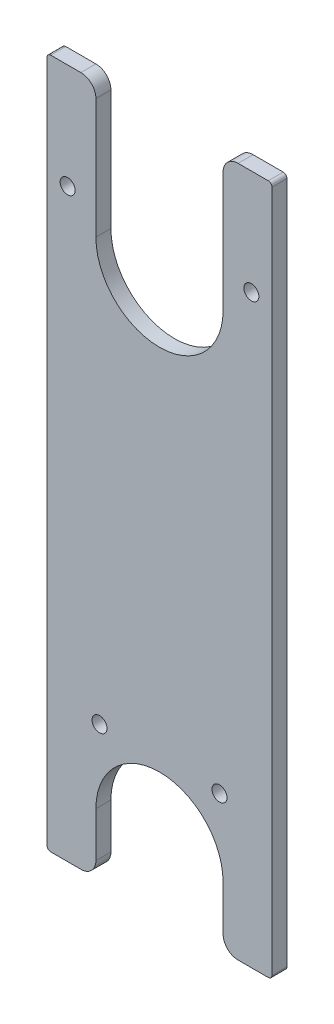
ISO-10303-21;
HEADER;
FILE_DESCRIPTION(('STEP AP214'),'2;1');
FILE_NAME('part.step','',(''),(''),'','','');
FILE_SCHEMA(('AUTOMOTIVE_DESIGN { 1 0 10303 214 1 1 1 1 }'));
ENDSEC;
DATA;
#1=APPLICATION_CONTEXT('core data for automotive mechanical design processes');
#2=APPLICATION_PROTOCOL_DEFINITION('international standard','automotive_design',2000,#1);
#3=PRODUCT_CONTEXT('',#1,'mechanical');
#4=PRODUCT('Part','Part','',(#3));
#5=PRODUCT_RELATED_PRODUCT_CATEGORY('part','',(#4));
#6=PRODUCT_DEFINITION_FORMATION('','',#4);
#7=PRODUCT_DEFINITION_CONTEXT('part definition',#1,'design');
#8=PRODUCT_DEFINITION('design','',#6,#7);
#9=PRODUCT_DEFINITION_SHAPE('','',#8);
#10=(LENGTH_UNIT() NAMED_UNIT(*) SI_UNIT(.MILLI.,.METRE.));
#11=(NAMED_UNIT(*) PLANE_ANGLE_UNIT() SI_UNIT($,.RADIAN.));
#12=(NAMED_UNIT(*) SI_UNIT($,.STERADIAN.) SOLID_ANGLE_UNIT());
#13=UNCERTAINTY_MEASURE_WITH_UNIT(LENGTH_MEASURE(1.E-05),#10,'distance_accuracy_value','');
#14=(GEOMETRIC_REPRESENTATION_CONTEXT(3) GLOBAL_UNCERTAINTY_ASSIGNED_CONTEXT((#13)) GLOBAL_UNIT_ASSIGNED_CONTEXT((#10,
#11,#12)) REPRESENTATION_CONTEXT('',''));
#15=CARTESIAN_POINT('',(0.,0.,0.));
#16=DIRECTION('',(0.,0.,1.));
#17=DIRECTION('',(1.,0.,0.));
#18=AXIS2_PLACEMENT_3D('',#15,#16,#17);
#19=CARTESIAN_POINT('',(-47.625,-279.4,6.35));
#20=DIRECTION('',(1.,0.,0.));
#21=DIRECTION('',(0.,0.,-1.));
#22=AXIS2_PLACEMENT_3D('',#19,#20,#21);
#23=PLANE('',#22);
#24=DIRECTION('',(0.,-1.,0.));
#25=VECTOR('',#24,1.);
#26=CARTESIAN_POINT('',(-47.625,-279.4,6.35));
#27=LINE('',#26,#25);
#28=CARTESIAN_POINT('',(-47.625,11.1125,6.35));
#29=VERTEX_POINT('',#28);
#30=CARTESIAN_POINT('',(-47.625,-277.8125,6.35));
#31=VERTEX_POINT('',#30);
#32=EDGE_CURVE('E281',#29,#31,#27,.T.);
#33=ORIENTED_EDGE('',*,*,#32,.F.);
#34=DIRECTION('',(0.,0.,-1.));
#35=VECTOR('',#34,1.);
#36=CARTESIAN_POINT('',(-47.625,11.1125,6.35));
#37=LINE('',#36,#35);
#38=CARTESIAN_POINT('',(-47.625,11.1125,0.));
#39=VERTEX_POINT('',#38);
#40=EDGE_CURVE('E347',#29,#39,#37,.T.);
#41=ORIENTED_EDGE('',*,*,#40,.T.);
#42=DIRECTION('',(0.,-1.,0.));
#43=VECTOR('',#42,1.);
#44=CARTESIAN_POINT('',(-47.625,-279.4,0.));
#45=LINE('',#44,#43);
#46=CARTESIAN_POINT('',(-47.625,-277.8125,0.));
#47=VERTEX_POINT('',#46);
#48=EDGE_CURVE('E239',#39,#47,#45,.T.);
#49=ORIENTED_EDGE('',*,*,#48,.T.);
#50=DIRECTION('',(0.,0.,-1.));
#51=VECTOR('',#50,1.);
#52=CARTESIAN_POINT('',(-47.625,-277.8125,6.35));
#53=LINE('',#52,#51);
#54=EDGE_CURVE('E344',#47,#31,#53,.F.);
#55=ORIENTED_EDGE('',*,*,#54,.T.);
#56=EDGE_LOOP('',(#33,#41,#49,#55));
#57=FACE_BOUND('',#56,.T.);
#58=ADVANCED_FACE('F40',(#57),#23,.F.);
#59=CARTESIAN_POINT('',(-47.625,-279.4,6.35));
#60=DIRECTION('',(0.,1.,0.));
#61=DIRECTION('',(0.,0.,1.));
#62=AXIS2_PLACEMENT_3D('',#59,#60,#61);
#63=PLANE('',#62);
#64=DIRECTION('',(1.,0.,0.));
#65=VECTOR('',#64,1.);
#66=CARTESIAN_POINT('',(-47.625,-279.4,6.35));
#67=LINE('',#66,#65);
#68=CARTESIAN_POINT('',(-46.0375,-279.4,6.35));
#69=VERTEX_POINT('',#68);
#70=CARTESIAN_POINT('',(-33.274,-279.4,6.35));
#71=VERTEX_POINT('',#70);
#72=EDGE_CURVE('E191',#69,#71,#67,.T.);
#73=ORIENTED_EDGE('',*,*,#72,.F.);
#74=DIRECTION('',(0.,0.,-1.));
#75=VECTOR('',#74,1.);
#76=CARTESIAN_POINT('',(-46.0375,-279.4,6.35));
#77=LINE('',#76,#75);
#78=CARTESIAN_POINT('',(-46.0375,-279.4,0.));
#79=VERTEX_POINT('',#78);
#80=EDGE_CURVE('E11',#69,#79,#77,.T.);
#81=ORIENTED_EDGE('',*,*,#80,.T.);
#82=DIRECTION('',(1.,0.,0.));
#83=VECTOR('',#82,1.);
#84=CARTESIAN_POINT('',(-47.625,-279.4,0.));
#85=LINE('',#84,#83);
#86=CARTESIAN_POINT('',(-33.274,-279.4,0.));
#87=VERTEX_POINT('',#86);
#88=EDGE_CURVE('E243',#79,#87,#85,.T.);
#89=ORIENTED_EDGE('',*,*,#88,.T.);
#90=DIRECTION('',(0.,0.,-1.));
#91=VECTOR('',#90,1.);
#92=CARTESIAN_POINT('',(-33.274,-279.4,6.35));
#93=LINE('',#92,#91);
#94=EDGE_CURVE('E325',#87,#71,#93,.F.);
#95=ORIENTED_EDGE('',*,*,#94,.T.);
#96=EDGE_LOOP('',(#73,#81,#89,#95));
#97=FACE_BOUND('',#96,.T.);
#98=ADVANCED_FACE('F512',(#97),#63,.F.);
#99=CARTESIAN_POINT('',(-26.924,-279.4,6.35));
#100=DIRECTION('',(-1.,0.,0.));
#101=DIRECTION('',(0.,-1.,0.));
#102=AXIS2_PLACEMENT_3D('',#99,#100,#101);
#103=PLANE('',#102);
#104=DIRECTION('',(0.,1.,0.));
#105=VECTOR('',#104,1.);
#106=CARTESIAN_POINT('',(-26.924,-279.4,6.35));
#107=LINE('',#106,#105);
#108=CARTESIAN_POINT('',(-26.924,-273.05,6.35));
#109=VERTEX_POINT('',#108);
#110=CARTESIAN_POINT('',(-26.924,-254.,6.35));
#111=VERTEX_POINT('',#110);
#112=EDGE_CURVE('E177',#109,#111,#107,.T.);
#113=ORIENTED_EDGE('',*,*,#112,.F.);
#114=DIRECTION('',(0.,0.,-1.));
#115=VECTOR('',#114,1.);
#116=CARTESIAN_POINT('',(-26.924,-273.05,6.35));
#117=LINE('',#116,#115);
#118=CARTESIAN_POINT('',(-26.924,-273.05,0.));
#119=VERTEX_POINT('',#118);
#120=EDGE_CURVE('E322',#109,#119,#117,.T.);
#121=ORIENTED_EDGE('',*,*,#120,.T.);
#122=DIRECTION('',(0.,1.,0.));
#123=VECTOR('',#122,1.);
#124=CARTESIAN_POINT('',(-26.924,-279.4,0.));
#125=LINE('',#124,#123);
#126=CARTESIAN_POINT('',(-26.924,-254.,0.));
#127=VERTEX_POINT('',#126);
#128=EDGE_CURVE('E197',#119,#127,#125,.T.);
#129=ORIENTED_EDGE('',*,*,#128,.T.);
#130=DIRECTION('',(0.,0.,-1.));
#131=VECTOR('',#130,1.);
#132=CARTESIAN_POINT('',(-26.924,-254.,6.35));
#133=LINE('',#132,#131);
#134=EDGE_CURVE('E194',#111,#127,#133,.T.);
#135=ORIENTED_EDGE('',*,*,#134,.F.);
#136=EDGE_LOOP('',(#113,#121,#129,#135));
#137=FACE_BOUND('',#136,.T.);
#138=ADVANCED_FACE('F195',(#137),#103,.F.);
#139=CARTESIAN_POINT('',(0.,-254.,6.35));
#140=DIRECTION('',(0.,0.,-1.));
#141=DIRECTION('',(-1.,0.,0.));
#142=AXIS2_PLACEMENT_3D('',#139,#140,#141);
#143=CYLINDRICAL_SURFACE('',#142,26.924);
#144=CARTESIAN_POINT('',(0.,-254.,0.));
#145=DIRECTION('',(0.,0.,-1.));
#146=DIRECTION('',(-1.,0.,0.));
#147=AXIS2_PLACEMENT_3D('',#144,#145,#146);
#148=CIRCLE('',#147,26.924);
#149=CARTESIAN_POINT('',(26.924,-254.,0.));
#150=VERTEX_POINT('',#149);
#151=EDGE_CURVE('E249',#127,#150,#148,.T.);
#152=ORIENTED_EDGE('',*,*,#151,.T.);
#153=DIRECTION('',(0.,0.,-1.));
#154=VECTOR('',#153,1.);
#155=CARTESIAN_POINT('',(26.924,-254.,6.35));
#156=LINE('',#155,#154);
#157=CARTESIAN_POINT('',(26.924,-254.,6.35));
#158=VERTEX_POINT('',#157);
#159=EDGE_CURVE('E202',#158,#150,#156,.T.);
#160=ORIENTED_EDGE('',*,*,#159,.F.);
#161=CARTESIAN_POINT('',(0.,-254.,6.35));
#162=DIRECTION('',(0.,0.,-1.));
#163=DIRECTION('',(-1.,0.,0.));
#164=AXIS2_PLACEMENT_3D('',#161,#162,#163);
#165=CIRCLE('',#164,26.924);
#166=EDGE_CURVE('E183',#111,#158,#165,.T.);
#167=ORIENTED_EDGE('',*,*,#166,.F.);
#168=ORIENTED_EDGE('',*,*,#134,.T.);
#169=EDGE_LOOP('',(#152,#160,#167,#168));
#170=FACE_BOUND('',#169,.T.);
#171=ADVANCED_FACE('F204',(#170),#143,.F.);
#172=CARTESIAN_POINT('',(26.924,-279.4,6.35));
#173=DIRECTION('',(1.,0.,0.));
#174=DIRECTION('',(0.,1.,0.));
#175=AXIS2_PLACEMENT_3D('',#172,#173,#174);
#176=PLANE('',#175);
#177=DIRECTION('',(0.,-1.,0.));
#178=VECTOR('',#177,1.);
#179=CARTESIAN_POINT('',(26.924,-279.4,0.));
#180=LINE('',#179,#178);
#181=CARTESIAN_POINT('',(26.924,-273.05,0.));
#182=VERTEX_POINT('',#181);
#183=EDGE_CURVE('E252',#150,#182,#180,.T.);
#184=ORIENTED_EDGE('',*,*,#183,.T.);
#185=DIRECTION('',(0.,0.,-1.));
#186=VECTOR('',#185,1.);
#187=CARTESIAN_POINT('',(26.924,-273.05,6.35));
#188=LINE('',#187,#186);
#189=CARTESIAN_POINT('',(26.924,-273.05,6.35));
#190=VERTEX_POINT('',#189);
#191=EDGE_CURVE('E308',#182,#190,#188,.F.);
#192=ORIENTED_EDGE('',*,*,#191,.T.);
#193=DIRECTION('',(0.,-1.,0.));
#194=VECTOR('',#193,1.);
#195=CARTESIAN_POINT('',(26.924,-279.4,6.35));
#196=LINE('',#195,#194);
#197=EDGE_CURVE('E208',#158,#190,#196,.T.);
#198=ORIENTED_EDGE('',*,*,#197,.F.);
#199=ORIENTED_EDGE('',*,*,#159,.T.);
#200=EDGE_LOOP('',(#184,#192,#198,#199));
#201=FACE_BOUND('',#200,.T.);
#202=ADVANCED_FACE('F700',(#201),#176,.F.);
#203=CARTESIAN_POINT('',(47.625,-279.4,6.35));
#204=DIRECTION('',(0.,1.,0.));
#205=DIRECTION('',(0.,0.,1.));
#206=AXIS2_PLACEMENT_3D('',#203,#204,#205);
#207=PLANE('',#206);
#208=DIRECTION('',(1.,0.,0.));
#209=VECTOR('',#208,1.);
#210=CARTESIAN_POINT('',(47.625,-279.4,0.));
#211=LINE('',#210,#209);
#212=CARTESIAN_POINT('',(33.274,-279.4,0.));
#213=VERTEX_POINT('',#212);
#214=CARTESIAN_POINT('',(46.0375,-279.4,0.));
#215=VERTEX_POINT('',#214);
#216=EDGE_CURVE('E256',#213,#215,#211,.T.);
#217=ORIENTED_EDGE('',*,*,#216,.T.);
#218=DIRECTION('',(0.,0.,-1.));
#219=VECTOR('',#218,1.);
#220=CARTESIAN_POINT('',(46.0375,-279.4,6.35));
#221=LINE('',#220,#219);
#222=CARTESIAN_POINT('',(46.0375,-279.4,6.35));
#223=VERTEX_POINT('',#222);
#224=EDGE_CURVE('E49',#215,#223,#221,.F.);
#225=ORIENTED_EDGE('',*,*,#224,.T.);
#226=DIRECTION('',(1.,0.,0.));
#227=VECTOR('',#226,1.);
#228=CARTESIAN_POINT('',(47.625,-279.4,6.35));
#229=LINE('',#228,#227);
#230=CARTESIAN_POINT('',(33.274,-279.4,6.35));
#231=VERTEX_POINT('',#230);
#232=EDGE_CURVE('E212',#231,#223,#229,.T.);
#233=ORIENTED_EDGE('',*,*,#232,.F.);
#234=DIRECTION('',(0.,0.,-1.));
#235=VECTOR('',#234,1.);
#236=CARTESIAN_POINT('',(33.274,-279.4,6.35));
#237=LINE('',#236,#235);
#238=EDGE_CURVE('E201',#231,#213,#237,.T.);
#239=ORIENTED_EDGE('',*,*,#238,.T.);
#240=EDGE_LOOP('',(#217,#225,#233,#239));
#241=FACE_BOUND('',#240,.T.);
#242=ADVANCED_FACE('F391',(#241),#207,.F.);
#243=CARTESIAN_POINT('',(47.625,-279.4,6.35));
#244=DIRECTION('',(-1.,0.,0.));
#245=DIRECTION('',(0.,-1.,0.));
#246=AXIS2_PLACEMENT_3D('',#243,#244,#245);
#247=PLANE('',#246);
#248=DIRECTION('',(0.,1.,0.));
#249=VECTOR('',#248,1.);
#250=CARTESIAN_POINT('',(47.625,-279.4,0.));
#251=LINE('',#250,#249);
#252=CARTESIAN_POINT('',(47.625,-277.8125,0.));
#253=VERTEX_POINT('',#252);
#254=CARTESIAN_POINT('',(47.625,11.1125,0.));
#255=VERTEX_POINT('',#254);
#256=EDGE_CURVE('E260',#253,#255,#251,.T.);
#257=ORIENTED_EDGE('',*,*,#256,.T.);
#258=DIRECTION('',(0.,0.,-1.));
#259=VECTOR('',#258,1.);
#260=CARTESIAN_POINT('',(47.625,11.1125,6.35));
#261=LINE('',#260,#259);
#262=CARTESIAN_POINT('',(47.625,11.1125,6.35));
#263=VERTEX_POINT('',#262);
#264=EDGE_CURVE('E384',#255,#263,#261,.F.);
#265=ORIENTED_EDGE('',*,*,#264,.T.);
#266=DIRECTION('',(0.,1.,0.));
#267=VECTOR('',#266,1.);
#268=CARTESIAN_POINT('',(47.625,-279.4,6.35));
#269=LINE('',#268,#267);
#270=CARTESIAN_POINT('',(47.625,-277.8125,6.35));
#271=VERTEX_POINT('',#270);
#272=EDGE_CURVE('E219',#271,#263,#269,.T.);
#273=ORIENTED_EDGE('',*,*,#272,.F.);
#274=DIRECTION('',(0.,0.,-1.));
#275=VECTOR('',#274,1.);
#276=CARTESIAN_POINT('',(47.625,-277.8125,6.35));
#277=LINE('',#276,#275);
#278=EDGE_CURVE('E380',#271,#253,#277,.T.);
#279=ORIENTED_EDGE('',*,*,#278,.T.);
#280=EDGE_LOOP('',(#257,#265,#273,#279));
#281=FACE_BOUND('',#280,.T.);
#282=ADVANCED_FACE('F402',(#281),#247,.F.);
#283=CARTESIAN_POINT('',(47.625,12.7,6.35));
#284=DIRECTION('',(0.,-1.,0.));
#285=DIRECTION('',(1.,0.,0.));
#286=AXIS2_PLACEMENT_3D('',#283,#284,#285);
#287=PLANE('',#286);
#288=DIRECTION('',(-1.,0.,0.));
#289=VECTOR('',#288,1.);
#290=CARTESIAN_POINT('',(47.625,12.7,6.35));
#291=LINE('',#290,#289);
#292=CARTESIAN_POINT('',(46.0375,12.7,6.35));
#293=VERTEX_POINT('',#292);
#294=CARTESIAN_POINT('',(33.274,12.7,6.35));
#295=VERTEX_POINT('',#294);
#296=EDGE_CURVE('E222',#293,#295,#291,.T.);
#297=ORIENTED_EDGE('',*,*,#296,.F.);
#298=DIRECTION('',(0.,0.,-1.));
#299=VECTOR('',#298,1.);
#300=CARTESIAN_POINT('',(46.0375,12.7,6.35));
#301=LINE('',#300,#299);
#302=CARTESIAN_POINT('',(46.0375,12.7,0.));
#303=VERTEX_POINT('',#302);
#304=EDGE_CURVE('E376',#293,#303,#301,.T.);
#305=ORIENTED_EDGE('',*,*,#304,.T.);
#306=DIRECTION('',(-1.,0.,0.));
#307=VECTOR('',#306,1.);
#308=CARTESIAN_POINT('',(47.625,12.7,0.));
#309=LINE('',#308,#307);
#310=CARTESIAN_POINT('',(33.274,12.7,0.));
#311=VERTEX_POINT('',#310);
#312=EDGE_CURVE('E264',#303,#311,#309,.T.);
#313=ORIENTED_EDGE('',*,*,#312,.T.);
#314=DIRECTION('',(0.,0.,-1.));
#315=VECTOR('',#314,1.);
#316=CARTESIAN_POINT('',(33.274,12.7,6.35));
#317=LINE('',#316,#315);
#318=EDGE_CURVE('E333',#311,#295,#317,.F.);
#319=ORIENTED_EDGE('',*,*,#318,.T.);
#320=EDGE_LOOP('',(#297,#305,#313,#319));
#321=FACE_BOUND('',#320,.T.);
#322=ADVANCED_FACE('F412',(#321),#287,.F.);
#323=CARTESIAN_POINT('',(26.924,12.7,6.35));
#324=DIRECTION('',(1.,0.,0.));
#325=DIRECTION('',(0.,1.,0.));
#326=AXIS2_PLACEMENT_3D('',#323,#324,#325);
#327=PLANE('',#326);
#328=DIRECTION('',(0.,-1.,0.));
#329=VECTOR('',#328,1.);
#330=CARTESIAN_POINT('',(26.924,12.7,6.35));
#331=LINE('',#330,#329);
#332=CARTESIAN_POINT('',(26.924,6.35000000000001,6.35));
#333=VERTEX_POINT('',#332);
#334=CARTESIAN_POINT('',(26.924,-44.45,6.35));
#335=VERTEX_POINT('',#334);
#336=EDGE_CURVE('E225',#333,#335,#331,.T.);
#337=ORIENTED_EDGE('',*,*,#336,.F.);
#338=DIRECTION('',(0.,0.,-1.));
#339=VECTOR('',#338,1.);
#340=CARTESIAN_POINT('',(26.924,6.35000000000001,6.35));
#341=LINE('',#340,#339);
#342=CARTESIAN_POINT('',(26.924,6.35000000000001,0.));
#343=VERTEX_POINT('',#342);
#344=EDGE_CURVE('E329',#333,#343,#341,.T.);
#345=ORIENTED_EDGE('',*,*,#344,.T.);
#346=DIRECTION('',(0.,-1.,0.));
#347=VECTOR('',#346,1.);
#348=CARTESIAN_POINT('',(26.924,12.7,0.));
#349=LINE('',#348,#347);
#350=CARTESIAN_POINT('',(26.924,-44.45,0.));
#351=VERTEX_POINT('',#350);
#352=EDGE_CURVE('E267',#343,#351,#349,.T.);
#353=ORIENTED_EDGE('',*,*,#352,.T.);
#354=DIRECTION('',(0.,0.,-1.));
#355=VECTOR('',#354,1.);
#356=CARTESIAN_POINT('',(26.924,-44.45,6.35));
#357=LINE('',#356,#355);
#358=EDGE_CURVE('E285',#335,#351,#357,.T.);
#359=ORIENTED_EDGE('',*,*,#358,.F.);
#360=EDGE_LOOP('',(#337,#345,#353,#359));
#361=FACE_BOUND('',#360,.T.);
#362=ADVANCED_FACE('F420',(#361),#327,.F.);
#363=CARTESIAN_POINT('',(0.,-44.45,6.35));
#364=DIRECTION('',(0.,0.,-1.));
#365=DIRECTION('',(-1.,0.,0.));
#366=AXIS2_PLACEMENT_3D('',#363,#364,#365);
#367=CYLINDRICAL_SURFACE('',#366,26.924);
#368=CARTESIAN_POINT('',(0.,-44.45,0.));
#369=DIRECTION('',(0.,0.,-1.));
#370=DIRECTION('',(1.,0.,0.));
#371=AXIS2_PLACEMENT_3D('',#368,#369,#370);
#372=CIRCLE('',#371,26.924);
#373=CARTESIAN_POINT('',(-26.924,-44.45,0.));
#374=VERTEX_POINT('',#373);
#375=EDGE_CURVE('E270',#351,#374,#372,.T.);
#376=ORIENTED_EDGE('',*,*,#375,.T.);
#377=DIRECTION('',(0.,0.,-1.));
#378=VECTOR('',#377,1.);
#379=CARTESIAN_POINT('',(-26.924,-44.45,6.35));
#380=LINE('',#379,#378);
#381=CARTESIAN_POINT('',(-26.924,-44.45,6.35));
#382=VERTEX_POINT('',#381);
#383=EDGE_CURVE('E238',#382,#374,#380,.T.);
#384=ORIENTED_EDGE('',*,*,#383,.F.);
#385=CARTESIAN_POINT('',(0.,-44.45,6.35));
#386=DIRECTION('',(0.,0.,-1.));
#387=DIRECTION('',(1.,0.,0.));
#388=AXIS2_PLACEMENT_3D('',#385,#386,#387);
#389=CIRCLE('',#388,26.924);
#390=EDGE_CURVE('E228',#335,#382,#389,.T.);
#391=ORIENTED_EDGE('',*,*,#390,.F.);
#392=ORIENTED_EDGE('',*,*,#358,.T.);
#393=EDGE_LOOP('',(#376,#384,#391,#392));
#394=FACE_BOUND('',#393,.T.);
#395=ADVANCED_FACE('F427',(#394),#367,.F.);
#396=CARTESIAN_POINT('',(-26.924,12.7,6.35));
#397=DIRECTION('',(-1.,0.,0.));
#398=DIRECTION('',(0.,-1.,0.));
#399=AXIS2_PLACEMENT_3D('',#396,#397,#398);
#400=PLANE('',#399);
#401=DIRECTION('',(0.,1.,0.));
#402=VECTOR('',#401,1.);
#403=CARTESIAN_POINT('',(-26.924,12.7,0.));
#404=LINE('',#403,#402);
#405=CARTESIAN_POINT('',(-26.924,6.35,0.));
#406=VERTEX_POINT('',#405);
#407=EDGE_CURVE('E273',#374,#406,#404,.T.);
#408=ORIENTED_EDGE('',*,*,#407,.T.);
#409=DIRECTION('',(0.,0.,-1.));
#410=VECTOR('',#409,1.);
#411=CARTESIAN_POINT('',(-26.924,6.35,6.35));
#412=LINE('',#411,#410);
#413=CARTESIAN_POINT('',(-26.924,6.35,6.35));
#414=VERTEX_POINT('',#413);
#415=EDGE_CURVE('E341',#406,#414,#412,.F.);
#416=ORIENTED_EDGE('',*,*,#415,.T.);
#417=DIRECTION('',(0.,1.,0.));
#418=VECTOR('',#417,1.);
#419=CARTESIAN_POINT('',(-26.924,12.7,6.35));
#420=LINE('',#419,#418);
#421=EDGE_CURVE('E231',#382,#414,#420,.T.);
#422=ORIENTED_EDGE('',*,*,#421,.F.);
#423=ORIENTED_EDGE('',*,*,#383,.T.);
#424=EDGE_LOOP('',(#408,#416,#422,#423));
#425=FACE_BOUND('',#424,.T.);
#426=ADVANCED_FACE('F649',(#425),#400,.F.);
#427=CARTESIAN_POINT('',(-47.625,12.7,6.35));
#428=DIRECTION('',(0.,-1.,0.));
#429=DIRECTION('',(0.,0.,-1.));
#430=AXIS2_PLACEMENT_3D('',#427,#428,#429);
#431=PLANE('',#430);
#432=DIRECTION('',(-1.,0.,0.));
#433=VECTOR('',#432,1.);
#434=CARTESIAN_POINT('',(-47.625,12.7,0.));
#435=LINE('',#434,#433);
#436=CARTESIAN_POINT('',(-33.274,12.7,0.));
#437=VERTEX_POINT('',#436);
#438=CARTESIAN_POINT('',(-46.0375,12.7,0.));
#439=VERTEX_POINT('',#438);
#440=EDGE_CURVE('E277',#437,#439,#435,.T.);
#441=ORIENTED_EDGE('',*,*,#440,.T.);
#442=DIRECTION('',(0.,0.,-1.));
#443=VECTOR('',#442,1.);
#444=CARTESIAN_POINT('',(-46.0375,12.7,6.35));
#445=LINE('',#444,#443);
#446=CARTESIAN_POINT('',(-46.0375,12.7,6.35));
#447=VERTEX_POINT('',#446);
#448=EDGE_CURVE('E363',#439,#447,#445,.F.);
#449=ORIENTED_EDGE('',*,*,#448,.T.);
#450=DIRECTION('',(-1.,0.,0.));
#451=VECTOR('',#450,1.);
#452=CARTESIAN_POINT('',(-47.625,12.7,6.35));
#453=LINE('',#452,#451);
#454=CARTESIAN_POINT('',(-33.274,12.7,6.35));
#455=VERTEX_POINT('',#454);
#456=EDGE_CURVE('E235',#455,#447,#453,.T.);
#457=ORIENTED_EDGE('',*,*,#456,.F.);
#458=DIRECTION('',(0.,0.,-1.));
#459=VECTOR('',#458,1.);
#460=CARTESIAN_POINT('',(-33.274,12.7,6.35));
#461=LINE('',#460,#459);
#462=EDGE_CURVE('E337',#455,#437,#461,.T.);
#463=ORIENTED_EDGE('',*,*,#462,.T.);
#464=EDGE_LOOP('',(#441,#449,#457,#463));
#465=FACE_BOUND('',#464,.T.);
#466=ADVANCED_FACE('F439',(#465),#431,.F.);
#467=CARTESIAN_POINT('',(0.,-44.45,6.35));
#468=DIRECTION('',(0.,0.,1.));
#469=DIRECTION('',(1.,0.,0.));
#470=AXIS2_PLACEMENT_3D('',#467,#468,#469);
#471=PLANE('',#470);
#472=CARTESIAN_POINT('',(-25.4,-222.25,6.35));
#473=DIRECTION('',(0.,0.,1.));
#474=DIRECTION('',(1.,0.,0.));
#475=AXIS2_PLACEMENT_3D('',#472,#473,#474);
#476=CIRCLE('',#475,3.17499999999999);
#477=CARTESIAN_POINT('',(-22.225,-222.25,6.35));
#478=VERTEX_POINT('',#477);
#479=EDGE_CURVE('E480',#478,#478,#476,.T.);
#480=ORIENTED_EDGE('',*,*,#479,.F.);
#481=EDGE_LOOP('',(#480));
#482=FACE_BOUND('',#481,.T.);
#483=CARTESIAN_POINT('',(-38.89375,-31.75,6.35));
#484=DIRECTION('',(0.,0.,1.));
#485=DIRECTION('',(1.,0.,0.));
#486=AXIS2_PLACEMENT_3D('',#483,#484,#485);
#487=CIRCLE('',#486,3.17499999999999);
#488=CARTESIAN_POINT('',(-35.71875,-31.75,6.35));
#489=VERTEX_POINT('',#488);
#490=EDGE_CURVE('E472',#489,#489,#487,.T.);
#491=ORIENTED_EDGE('',*,*,#490,.F.);
#492=EDGE_LOOP('',(#491));
#493=FACE_BOUND('',#492,.T.);
#494=CARTESIAN_POINT('',(38.89375,-31.75,6.35));
#495=DIRECTION('',(0.,0.,1.));
#496=DIRECTION('',(1.,0.,0.));
#497=AXIS2_PLACEMENT_3D('',#494,#495,#496);
#498=CIRCLE('',#497,3.17499999999999);
#499=CARTESIAN_POINT('',(42.06875,-31.75,6.35));
#500=VERTEX_POINT('',#499);
#501=EDGE_CURVE('E464',#500,#500,#498,.T.);
#502=ORIENTED_EDGE('',*,*,#501,.F.);
#503=EDGE_LOOP('',(#502));
#504=FACE_BOUND('',#503,.T.);
#505=CARTESIAN_POINT('',(25.4,-222.25,6.35));
#506=DIRECTION('',(0.,0.,1.));
#507=DIRECTION('',(1.,0.,0.));
#508=AXIS2_PLACEMENT_3D('',#505,#506,#507);
#509=CIRCLE('',#508,3.17499999999999);
#510=CARTESIAN_POINT('',(28.575,-222.25,6.35));
#511=VERTEX_POINT('',#510);
#512=EDGE_CURVE('E456',#511,#511,#509,.T.);
#513=ORIENTED_EDGE('',*,*,#512,.F.);
#514=EDGE_LOOP('',(#513));
#515=FACE_BOUND('',#514,.T.);
#516=ORIENTED_EDGE('',*,*,#456,.T.);
#517=CARTESIAN_POINT('',(-46.0375,11.1125,6.35));
#518=DIRECTION('',(0.,0.,1.));
#519=DIRECTION('',(1.,0.,0.));
#520=AXIS2_PLACEMENT_3D('',#517,#518,#519);
#521=CIRCLE('',#520,1.5875);
#522=EDGE_CURVE('E373',#447,#29,#521,.T.);
#523=ORIENTED_EDGE('',*,*,#522,.T.);
#524=ORIENTED_EDGE('',*,*,#32,.T.);
#525=CARTESIAN_POINT('',(-46.0375,-277.8125,6.35));
#526=DIRECTION('',(0.,0.,1.));
#527=DIRECTION('',(1.,0.,0.));
#528=AXIS2_PLACEMENT_3D('',#525,#526,#527);
#529=CIRCLE('',#528,1.5875);
#530=EDGE_CURVE('E56',#31,#69,#529,.T.);
#531=ORIENTED_EDGE('',*,*,#530,.T.);
#532=ORIENTED_EDGE('',*,*,#72,.T.);
#533=CARTESIAN_POINT('',(-33.274,-273.05,6.35));
#534=DIRECTION('',(0.,0.,1.));
#535=DIRECTION('',(1.,0.,0.));
#536=AXIS2_PLACEMENT_3D('',#533,#534,#535);
#537=CIRCLE('',#536,6.35);
#538=EDGE_CURVE('E186',#71,#109,#537,.T.);
#539=ORIENTED_EDGE('',*,*,#538,.T.);
#540=ORIENTED_EDGE('',*,*,#112,.T.);
#541=ORIENTED_EDGE('',*,*,#166,.T.);
#542=ORIENTED_EDGE('',*,*,#197,.T.);
#543=CARTESIAN_POINT('',(33.274,-273.05,6.35));
#544=DIRECTION('',(0.,0.,1.));
#545=DIRECTION('',(1.,0.,0.));
#546=AXIS2_PLACEMENT_3D('',#543,#544,#545);
#547=CIRCLE('',#546,6.35);
#548=EDGE_CURVE('E319',#190,#231,#547,.T.);
#549=ORIENTED_EDGE('',*,*,#548,.T.);
#550=ORIENTED_EDGE('',*,*,#232,.T.);
#551=CARTESIAN_POINT('',(46.0375,-277.8125,6.35));
#552=DIRECTION('',(0.,0.,1.));
#553=DIRECTION('',(1.,0.,0.));
#554=AXIS2_PLACEMENT_3D('',#551,#552,#553);
#555=CIRCLE('',#554,1.5875);
#556=EDGE_CURVE('E368',#223,#271,#555,.T.);
#557=ORIENTED_EDGE('',*,*,#556,.T.);
#558=ORIENTED_EDGE('',*,*,#272,.T.);
#559=CARTESIAN_POINT('',(46.0375,11.1125,6.35));
#560=DIRECTION('',(0.,0.,1.));
#561=DIRECTION('',(1.,0.,0.));
#562=AXIS2_PLACEMENT_3D('',#559,#560,#561);
#563=CIRCLE('',#562,1.5875);
#564=EDGE_CURVE('E63',#263,#293,#563,.T.);
#565=ORIENTED_EDGE('',*,*,#564,.T.);
#566=ORIENTED_EDGE('',*,*,#296,.T.);
#567=CARTESIAN_POINT('',(33.274,6.35000000000001,6.35));
#568=DIRECTION('',(0.,0.,1.));
#569=DIRECTION('',(1.,0.,0.));
#570=AXIS2_PLACEMENT_3D('',#567,#568,#569);
#571=CIRCLE('',#570,6.35);
#572=EDGE_CURVE('E314',#295,#333,#571,.T.);
#573=ORIENTED_EDGE('',*,*,#572,.T.);
#574=ORIENTED_EDGE('',*,*,#336,.T.);
#575=ORIENTED_EDGE('',*,*,#390,.T.);
#576=ORIENTED_EDGE('',*,*,#421,.T.);
#577=CARTESIAN_POINT('',(-33.274,6.35,6.35));
#578=DIRECTION('',(0.,0.,1.));
#579=DIRECTION('',(1.,0.,0.));
#580=AXIS2_PLACEMENT_3D('',#577,#578,#579);
#581=CIRCLE('',#580,6.35);
#582=EDGE_CURVE('E311',#414,#455,#581,.T.);
#583=ORIENTED_EDGE('',*,*,#582,.T.);
#584=EDGE_LOOP('',(#516,#523,#524,#531,#532,#539,#540,#541,#542,#549,#550,#557,#558,#565,#566,
#573,#574,#575,#576,#583));
#585=FACE_BOUND('',#584,.T.);
#586=ADVANCED_FACE('F180',(#482,#493,#504,#515,#585),#471,.T.);
#587=CARTESIAN_POINT('',(0.,-44.45,0.));
#588=DIRECTION('',(0.,0.,1.));
#589=DIRECTION('',(1.,0.,0.));
#590=AXIS2_PLACEMENT_3D('',#587,#588,#589);
#591=PLANE('',#590);
#592=CARTESIAN_POINT('',(-25.4,-222.25,0.));
#593=DIRECTION('',(0.,0.,1.));
#594=DIRECTION('',(1.,0.,0.));
#595=AXIS2_PLACEMENT_3D('',#592,#593,#594);
#596=CIRCLE('',#595,3.17499999999999);
#597=CARTESIAN_POINT('',(-22.225,-222.25,0.));
#598=VERTEX_POINT('',#597);
#599=EDGE_CURVE('E476',#598,#598,#596,.T.);
#600=ORIENTED_EDGE('',*,*,#599,.T.);
#601=EDGE_LOOP('',(#600));
#602=FACE_BOUND('',#601,.T.);
#603=CARTESIAN_POINT('',(-38.89375,-31.75,0.));
#604=DIRECTION('',(0.,0.,1.));
#605=DIRECTION('',(1.,0.,0.));
#606=AXIS2_PLACEMENT_3D('',#603,#604,#605);
#607=CIRCLE('',#606,3.17499999999999);
#608=CARTESIAN_POINT('',(-35.71875,-31.75,0.));
#609=VERTEX_POINT('',#608);
#610=EDGE_CURVE('E468',#609,#609,#607,.T.);
#611=ORIENTED_EDGE('',*,*,#610,.T.);
#612=EDGE_LOOP('',(#611));
#613=FACE_BOUND('',#612,.T.);
#614=CARTESIAN_POINT('',(38.89375,-31.75,0.));
#615=DIRECTION('',(0.,0.,1.));
#616=DIRECTION('',(1.,0.,0.));
#617=AXIS2_PLACEMENT_3D('',#614,#615,#616);
#618=CIRCLE('',#617,3.17499999999999);
#619=CARTESIAN_POINT('',(42.06875,-31.75,0.));
#620=VERTEX_POINT('',#619);
#621=EDGE_CURVE('E460',#620,#620,#618,.T.);
#622=ORIENTED_EDGE('',*,*,#621,.T.);
#623=EDGE_LOOP('',(#622));
#624=FACE_BOUND('',#623,.T.);
#625=CARTESIAN_POINT('',(25.4,-222.25,0.));
#626=DIRECTION('',(0.,0.,1.));
#627=DIRECTION('',(1.,0.,0.));
#628=AXIS2_PLACEMENT_3D('',#625,#626,#627);
#629=CIRCLE('',#628,3.17499999999999);
#630=CARTESIAN_POINT('',(28.575,-222.25,0.));
#631=VERTEX_POINT('',#630);
#632=EDGE_CURVE('E244',#631,#631,#629,.T.);
#633=ORIENTED_EDGE('',*,*,#632,.T.);
#634=EDGE_LOOP('',(#633));
#635=FACE_BOUND('',#634,.T.);
#636=ORIENTED_EDGE('',*,*,#48,.F.);
#637=CARTESIAN_POINT('',(-46.0375,11.1125,0.));
#638=DIRECTION('',(0.,0.,1.));
#639=DIRECTION('',(1.,0.,0.));
#640=AXIS2_PLACEMENT_3D('',#637,#638,#639);
#641=CIRCLE('',#640,1.5875);
#642=EDGE_CURVE('E360',#39,#439,#641,.F.);
#643=ORIENTED_EDGE('',*,*,#642,.T.);
#644=ORIENTED_EDGE('',*,*,#440,.F.);
#645=CARTESIAN_POINT('',(-33.274,6.35,0.));
#646=DIRECTION('',(0.,0.,1.));
#647=DIRECTION('',(1.,0.,0.));
#648=AXIS2_PLACEMENT_3D('',#645,#646,#647);
#649=CIRCLE('',#648,6.35);
#650=EDGE_CURVE('E294',#437,#406,#649,.F.);
#651=ORIENTED_EDGE('',*,*,#650,.T.);
#652=ORIENTED_EDGE('',*,*,#407,.F.);
#653=ORIENTED_EDGE('',*,*,#375,.F.);
#654=ORIENTED_EDGE('',*,*,#352,.F.);
#655=CARTESIAN_POINT('',(33.274,6.35000000000001,0.));
#656=DIRECTION('',(0.,0.,1.));
#657=DIRECTION('',(1.,0.,0.));
#658=AXIS2_PLACEMENT_3D('',#655,#656,#657);
#659=CIRCLE('',#658,6.35);
#660=EDGE_CURVE('E297',#343,#311,#659,.F.);
#661=ORIENTED_EDGE('',*,*,#660,.T.);
#662=ORIENTED_EDGE('',*,*,#312,.F.);
#663=CARTESIAN_POINT('',(46.0375,11.1125,0.));
#664=DIRECTION('',(0.,0.,1.));
#665=DIRECTION('',(1.,0.,0.));
#666=AXIS2_PLACEMENT_3D('',#663,#664,#665);
#667=CIRCLE('',#666,1.5875);
#668=EDGE_CURVE('E357',#303,#255,#667,.F.);
#669=ORIENTED_EDGE('',*,*,#668,.T.);
#670=ORIENTED_EDGE('',*,*,#256,.F.);
#671=CARTESIAN_POINT('',(46.0375,-277.8125,0.));
#672=DIRECTION('',(0.,0.,1.));
#673=DIRECTION('',(1.,0.,0.));
#674=AXIS2_PLACEMENT_3D('',#671,#672,#673);
#675=CIRCLE('',#674,1.5875);
#676=EDGE_CURVE('E354',#253,#215,#675,.F.);
#677=ORIENTED_EDGE('',*,*,#676,.T.);
#678=ORIENTED_EDGE('',*,*,#216,.F.);
#679=CARTESIAN_POINT('',(33.274,-273.05,0.));
#680=DIRECTION('',(0.,0.,1.));
#681=DIRECTION('',(1.,0.,0.));
#682=AXIS2_PLACEMENT_3D('',#679,#680,#681);
#683=CIRCLE('',#682,6.35);
#684=EDGE_CURVE('E305',#213,#182,#683,.F.);
#685=ORIENTED_EDGE('',*,*,#684,.T.);
#686=ORIENTED_EDGE('',*,*,#183,.F.);
#687=ORIENTED_EDGE('',*,*,#151,.F.);
#688=ORIENTED_EDGE('',*,*,#128,.F.);
#689=CARTESIAN_POINT('',(-33.274,-273.05,0.));
#690=DIRECTION('',(0.,0.,1.));
#691=DIRECTION('',(1.,0.,0.));
#692=AXIS2_PLACEMENT_3D('',#689,#690,#691);
#693=CIRCLE('',#692,6.35);
#694=EDGE_CURVE('E301',#119,#87,#693,.F.);
#695=ORIENTED_EDGE('',*,*,#694,.T.);
#696=ORIENTED_EDGE('',*,*,#88,.F.);
#697=CARTESIAN_POINT('',(-46.0375,-277.8125,0.));
#698=DIRECTION('',(0.,0.,1.));
#699=DIRECTION('',(1.,0.,0.));
#700=AXIS2_PLACEMENT_3D('',#697,#698,#699);
#701=CIRCLE('',#700,1.5875);
#702=EDGE_CURVE('E351',#79,#47,#701,.F.);
#703=ORIENTED_EDGE('',*,*,#702,.T.);
#704=EDGE_LOOP('',(#636,#643,#644,#651,#652,#653,#654,#661,#662,#669,#670,#677,#678,#685,#686,
#687,#688,#695,#696,#703));
#705=FACE_BOUND('',#704,.T.);
#706=ADVANCED_FACE('F406',(#602,#613,#624,#635,#705),#591,.F.);
#707=CARTESIAN_POINT('',(33.274,-273.05,6.35));
#708=DIRECTION('',(0.,0.,-1.));
#709=DIRECTION('',(-1.,0.,0.));
#710=AXIS2_PLACEMENT_3D('',#707,#708,#709);
#711=CYLINDRICAL_SURFACE('',#710,6.35);
#712=ORIENTED_EDGE('',*,*,#548,.F.);
#713=ORIENTED_EDGE('',*,*,#191,.F.);
#714=ORIENTED_EDGE('',*,*,#684,.F.);
#715=ORIENTED_EDGE('',*,*,#238,.F.);
#716=EDGE_LOOP('',(#712,#713,#714,#715));
#717=FACE_BOUND('',#716,.T.);
#718=ADVANCED_FACE('F521',(#717),#711,.T.);
#719=CARTESIAN_POINT('',(-33.274,-273.05,6.35));
#720=DIRECTION('',(0.,0.,-1.));
#721=DIRECTION('',(-1.,0.,0.));
#722=AXIS2_PLACEMENT_3D('',#719,#720,#721);
#723=CYLINDRICAL_SURFACE('',#722,6.35);
#724=ORIENTED_EDGE('',*,*,#538,.F.);
#725=ORIENTED_EDGE('',*,*,#94,.F.);
#726=ORIENTED_EDGE('',*,*,#694,.F.);
#727=ORIENTED_EDGE('',*,*,#120,.F.);
#728=EDGE_LOOP('',(#724,#725,#726,#727));
#729=FACE_BOUND('',#728,.T.);
#730=ADVANCED_FACE('F524',(#729),#723,.T.);
#731=CARTESIAN_POINT('',(33.274,6.35000000000001,6.35));
#732=DIRECTION('',(0.,0.,-1.));
#733=DIRECTION('',(-1.,0.,0.));
#734=AXIS2_PLACEMENT_3D('',#731,#732,#733);
#735=CYLINDRICAL_SURFACE('',#734,6.35);
#736=ORIENTED_EDGE('',*,*,#572,.F.);
#737=ORIENTED_EDGE('',*,*,#318,.F.);
#738=ORIENTED_EDGE('',*,*,#660,.F.);
#739=ORIENTED_EDGE('',*,*,#344,.F.);
#740=EDGE_LOOP('',(#736,#737,#738,#739));
#741=FACE_BOUND('',#740,.T.);
#742=ADVANCED_FACE('F423',(#741),#735,.T.);
#743=CARTESIAN_POINT('',(-33.274,6.35,6.35));
#744=DIRECTION('',(0.,0.,-1.));
#745=DIRECTION('',(-1.,0.,0.));
#746=AXIS2_PLACEMENT_3D('',#743,#744,#745);
#747=CYLINDRICAL_SURFACE('',#746,6.35);
#748=ORIENTED_EDGE('',*,*,#582,.F.);
#749=ORIENTED_EDGE('',*,*,#415,.F.);
#750=ORIENTED_EDGE('',*,*,#650,.F.);
#751=ORIENTED_EDGE('',*,*,#462,.F.);
#752=EDGE_LOOP('',(#748,#749,#750,#751));
#753=FACE_BOUND('',#752,.T.);
#754=ADVANCED_FACE('F436',(#753),#747,.T.);
#755=CARTESIAN_POINT('',(-46.0375,11.1125,6.35));
#756=DIRECTION('',(0.,0.,-1.));
#757=DIRECTION('',(-1.,0.,0.));
#758=AXIS2_PLACEMENT_3D('',#755,#756,#757);
#759=CYLINDRICAL_SURFACE('',#758,1.5875);
#760=ORIENTED_EDGE('',*,*,#522,.F.);
#761=ORIENTED_EDGE('',*,*,#448,.F.);
#762=ORIENTED_EDGE('',*,*,#642,.F.);
#763=ORIENTED_EDGE('',*,*,#40,.F.);
#764=EDGE_LOOP('',(#760,#761,#762,#763));
#765=FACE_BOUND('',#764,.T.);
#766=ADVANCED_FACE('F444',(#765),#759,.T.);
#767=CARTESIAN_POINT('',(46.0375,11.1125,6.35));
#768=DIRECTION('',(0.,0.,-1.));
#769=DIRECTION('',(-1.,0.,0.));
#770=AXIS2_PLACEMENT_3D('',#767,#768,#769);
#771=CYLINDRICAL_SURFACE('',#770,1.5875);
#772=ORIENTED_EDGE('',*,*,#564,.F.);
#773=ORIENTED_EDGE('',*,*,#264,.F.);
#774=ORIENTED_EDGE('',*,*,#668,.F.);
#775=ORIENTED_EDGE('',*,*,#304,.F.);
#776=EDGE_LOOP('',(#772,#773,#774,#775));
#777=FACE_BOUND('',#776,.T.);
#778=ADVANCED_FACE('F410',(#777),#771,.T.);
#779=CARTESIAN_POINT('',(46.0375,-277.8125,6.35));
#780=DIRECTION('',(0.,0.,-1.));
#781=DIRECTION('',(-1.,0.,0.));
#782=AXIS2_PLACEMENT_3D('',#779,#780,#781);
#783=CYLINDRICAL_SURFACE('',#782,1.5875);
#784=ORIENTED_EDGE('',*,*,#556,.F.);
#785=ORIENTED_EDGE('',*,*,#224,.F.);
#786=ORIENTED_EDGE('',*,*,#676,.F.);
#787=ORIENTED_EDGE('',*,*,#278,.F.);
#788=EDGE_LOOP('',(#784,#785,#786,#787));
#789=FACE_BOUND('',#788,.T.);
#790=ADVANCED_FACE('F399',(#789),#783,.T.);
#791=CARTESIAN_POINT('',(-46.0375,-277.8125,6.35));
#792=DIRECTION('',(0.,0.,-1.));
#793=DIRECTION('',(-1.,0.,0.));
#794=AXIS2_PLACEMENT_3D('',#791,#792,#793);
#795=CYLINDRICAL_SURFACE('',#794,1.5875);
#796=ORIENTED_EDGE('',*,*,#530,.F.);
#797=ORIENTED_EDGE('',*,*,#54,.F.);
#798=ORIENTED_EDGE('',*,*,#702,.F.);
#799=ORIENTED_EDGE('',*,*,#80,.F.);
#800=EDGE_LOOP('',(#796,#797,#798,#799));
#801=FACE_BOUND('',#800,.T.);
#802=ADVANCED_FACE('F42',(#801),#795,.T.);
#803=CARTESIAN_POINT('',(25.4,-222.25,6.35));
#804=DIRECTION('',(0.,0.,1.));
#805=DIRECTION('',(1.,0.,0.));
#806=AXIS2_PLACEMENT_3D('',#803,#804,#805);
#807=CYLINDRICAL_SURFACE('',#806,3.17499999999999);
#808=ORIENTED_EDGE('',*,*,#632,.F.);
#809=EDGE_LOOP('',(#808));
#810=FACE_BOUND('',#809,.T.);
#811=ORIENTED_EDGE('',*,*,#512,.T.);
#812=EDGE_LOOP('',(#811));
#813=FACE_BOUND('',#812,.T.);
#814=ADVANCED_FACE('F497',(#810,#813),#807,.F.);
#815=CARTESIAN_POINT('',(38.89375,-31.75,6.35));
#816=DIRECTION('',(0.,0.,1.));
#817=DIRECTION('',(1.,0.,0.));
#818=AXIS2_PLACEMENT_3D('',#815,#816,#817);
#819=CYLINDRICAL_SURFACE('',#818,3.17499999999999);
#820=ORIENTED_EDGE('',*,*,#621,.F.);
#821=EDGE_LOOP('',(#820));
#822=FACE_BOUND('',#821,.T.);
#823=ORIENTED_EDGE('',*,*,#501,.T.);
#824=EDGE_LOOP('',(#823));
#825=FACE_BOUND('',#824,.T.);
#826=ADVANCED_FACE('F499',(#822,#825),#819,.F.);
#827=CARTESIAN_POINT('',(-38.89375,-31.75,6.35));
#828=DIRECTION('',(0.,0.,1.));
#829=DIRECTION('',(1.,0.,0.));
#830=AXIS2_PLACEMENT_3D('',#827,#828,#829);
#831=CYLINDRICAL_SURFACE('',#830,3.17499999999999);
#832=ORIENTED_EDGE('',*,*,#610,.F.);
#833=EDGE_LOOP('',(#832));
#834=FACE_BOUND('',#833,.T.);
#835=ORIENTED_EDGE('',*,*,#490,.T.);
#836=EDGE_LOOP('',(#835));
#837=FACE_BOUND('',#836,.T.);
#838=ADVANCED_FACE('F506',(#834,#837),#831,.F.);
#839=CARTESIAN_POINT('',(-25.4,-222.25,6.35));
#840=DIRECTION('',(0.,0.,1.));
#841=DIRECTION('',(1.,0.,0.));
#842=AXIS2_PLACEMENT_3D('',#839,#840,#841);
#843=CYLINDRICAL_SURFACE('',#842,3.17499999999999);
#844=ORIENTED_EDGE('',*,*,#599,.F.);
#845=EDGE_LOOP('',(#844));
#846=FACE_BOUND('',#845,.T.);
#847=ORIENTED_EDGE('',*,*,#479,.T.);
#848=EDGE_LOOP('',(#847));
#849=FACE_BOUND('',#848,.T.);
#850=ADVANCED_FACE('F486',(#846,#849),#843,.F.);
#851=CLOSED_SHELL('',(#58,#98,#138,#171,#202,#242,#282,#322,#362,#395,#426,#466,#586,#706,#718,
#730,#742,#754,#766,#778,#790,#802,#814,#826,#838,#850));
#852=MANIFOLD_SOLID_BREP('B2',#851);
#853=ADVANCED_BREP_SHAPE_REPRESENTATION('',(#18,#852),#14);
#854=SHAPE_DEFINITION_REPRESENTATION(#9,#853);
ENDSEC;
END-ISO-10303-21;
